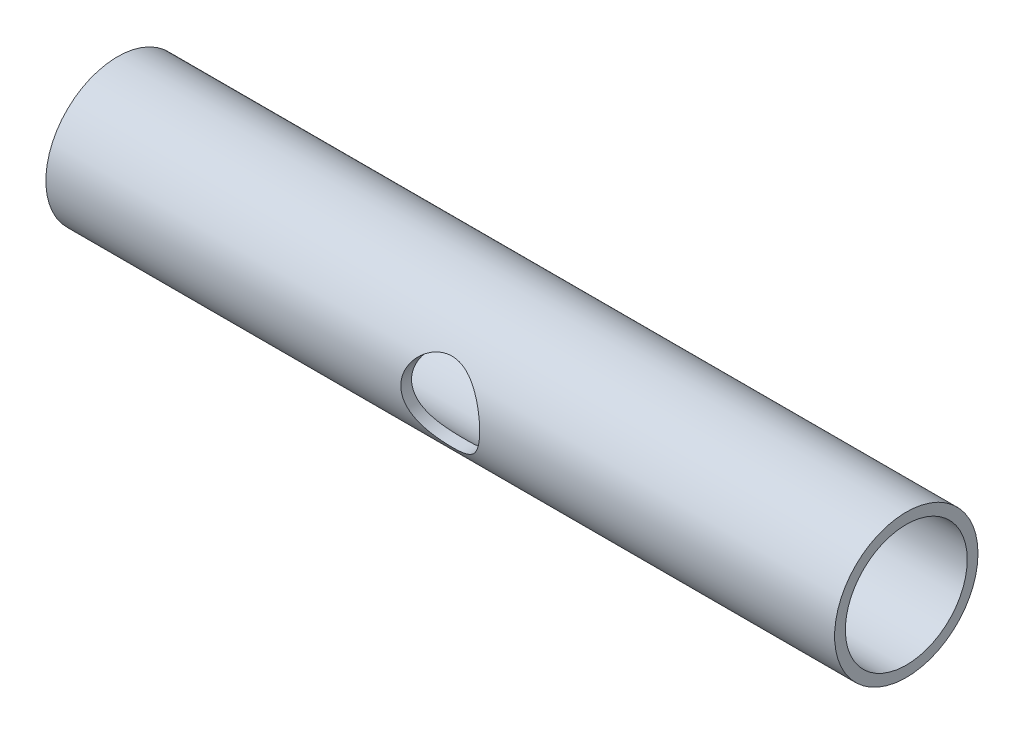
ISO-10303-21;
HEADER;
FILE_DESCRIPTION(('STEP AP214'),'2;1');
FILE_NAME('part.step','',(''),(''),'','','');
FILE_SCHEMA(('AUTOMOTIVE_DESIGN { 1 0 10303 214 1 1 1 1 }'));
ENDSEC;
DATA;
#1=APPLICATION_CONTEXT('core data for automotive mechanical design processes');
#2=APPLICATION_PROTOCOL_DEFINITION('international standard','automotive_design',2000,#1);
#3=PRODUCT_CONTEXT('',#1,'mechanical');
#4=PRODUCT('Part','Part','',(#3));
#5=PRODUCT_RELATED_PRODUCT_CATEGORY('part','',(#4));
#6=PRODUCT_DEFINITION_FORMATION('','',#4);
#7=PRODUCT_DEFINITION_CONTEXT('part definition',#1,'design');
#8=PRODUCT_DEFINITION('design','',#6,#7);
#9=PRODUCT_DEFINITION_SHAPE('','',#8);
#10=(LENGTH_UNIT() NAMED_UNIT(*) SI_UNIT(.MILLI.,.METRE.));
#11=(NAMED_UNIT(*) PLANE_ANGLE_UNIT() SI_UNIT($,.RADIAN.));
#12=(NAMED_UNIT(*) SI_UNIT($,.STERADIAN.) SOLID_ANGLE_UNIT());
#13=UNCERTAINTY_MEASURE_WITH_UNIT(LENGTH_MEASURE(1.E-05),#10,'distance_accuracy_value','');
#14=(GEOMETRIC_REPRESENTATION_CONTEXT(3) GLOBAL_UNCERTAINTY_ASSIGNED_CONTEXT((#13)) GLOBAL_UNIT_ASSIGNED_CONTEXT((#10,
#11,#12)) REPRESENTATION_CONTEXT('',''));
#15=CARTESIAN_POINT('',(0.,0.,0.));
#16=DIRECTION('',(0.,0.,1.));
#17=DIRECTION('',(1.,0.,0.));
#18=AXIS2_PLACEMENT_3D('',#15,#16,#17);
#19=CARTESIAN_POINT('',(110.,0.,0.));
#20=DIRECTION('',(1.,0.,0.));
#21=DIRECTION('',(0.,0.,-1.));
#22=AXIS2_PLACEMENT_3D('',#19,#20,#21);
#23=PLANE('',#22);
#24=CARTESIAN_POINT('',(110.,0.,0.));
#25=DIRECTION('',(1.,0.,0.));
#26=DIRECTION('',(0.,0.,-1.));
#27=AXIS2_PLACEMENT_3D('',#24,#25,#26);
#28=CIRCLE('',#27,10.);
#29=CARTESIAN_POINT('',(110.,0.,-10.));
#30=VERTEX_POINT('',#29);
#31=EDGE_CURVE('E10',#30,#30,#28,.T.);
#32=ORIENTED_EDGE('',*,*,#31,.T.);
#33=EDGE_LOOP('',(#32));
#34=FACE_BOUND('',#33,.T.);
#35=CARTESIAN_POINT('',(110.,0.,0.));
#36=DIRECTION('',(1.,0.,0.));
#37=DIRECTION('',(0.,0.,-1.));
#38=AXIS2_PLACEMENT_3D('',#35,#36,#37);
#39=CIRCLE('',#38,8.5);
#40=CARTESIAN_POINT('',(110.,0.,-8.5));
#41=VERTEX_POINT('',#40);
#42=EDGE_CURVE('E55',#41,#41,#39,.T.);
#43=ORIENTED_EDGE('',*,*,#42,.F.);
#44=EDGE_LOOP('',(#43));
#45=FACE_BOUND('',#44,.T.);
#46=ADVANCED_FACE('F36',(#34,#45),#23,.T.);
#47=CARTESIAN_POINT('',(0.,0.,0.));
#48=DIRECTION('',(1.,0.,0.));
#49=DIRECTION('',(0.,0.,-1.));
#50=AXIS2_PLACEMENT_3D('',#47,#48,#49);
#51=PLANE('',#50);
#52=CARTESIAN_POINT('',(0.,0.,0.));
#53=DIRECTION('',(1.,0.,0.));
#54=DIRECTION('',(0.,0.,-1.));
#55=AXIS2_PLACEMENT_3D('',#52,#53,#54);
#56=CIRCLE('',#55,10.);
#57=CARTESIAN_POINT('',(0.,0.,-10.));
#58=VERTEX_POINT('',#57);
#59=EDGE_CURVE('E50',#58,#58,#56,.T.);
#60=ORIENTED_EDGE('',*,*,#59,.F.);
#61=EDGE_LOOP('',(#60));
#62=FACE_BOUND('',#61,.T.);
#63=CARTESIAN_POINT('',(0.,0.,0.));
#64=DIRECTION('',(1.,0.,0.));
#65=DIRECTION('',(0.,0.,-1.));
#66=AXIS2_PLACEMENT_3D('',#63,#64,#65);
#67=CIRCLE('',#66,8.5);
#68=CARTESIAN_POINT('',(0.,0.,-8.5));
#69=VERTEX_POINT('',#68);
#70=EDGE_CURVE('E58',#69,#69,#67,.T.);
#71=ORIENTED_EDGE('',*,*,#70,.T.);
#72=EDGE_LOOP('',(#71));
#73=FACE_BOUND('',#72,.T.);
#74=ADVANCED_FACE('F94',(#62,#73),#51,.F.);
#75=CARTESIAN_POINT('',(110.,0.,0.));
#76=DIRECTION('',(-1.,0.,0.));
#77=DIRECTION('',(0.,0.,1.));
#78=AXIS2_PLACEMENT_3D('',#75,#76,#77);
#79=CYLINDRICAL_SURFACE('',#78,10.);
#80=CARTESIAN_POINT('',(60.5,0.,-10.));
#81=CARTESIAN_POINT('',(60.5000014998061,0.142841752058878,-10.0000013253171));
#82=CARTESIAN_POINT('',(60.4944302367165,0.285665986079781,-9.9969335195706));
#83=CARTESIAN_POINT('',(60.47222036742,0.570239689293178,-9.98474372414085));
#84=CARTESIAN_POINT('',(60.4555784971668,0.711988829035867,-9.97561994892361));
#85=CARTESIAN_POINT('',(60.4114178031942,0.993411840442092,-9.95153761632946));
#86=CARTESIAN_POINT('',(60.3838885957706,1.1330835984815,-9.9365734889463));
#87=CARTESIAN_POINT('',(60.3182807694013,1.40927178286025,-9.9011791338125));
#88=CARTESIAN_POINT('',(60.2801978420495,1.54578689583191,-9.88074667380979));
#89=CARTESIAN_POINT('',(60.194110823273,1.81410275102406,-9.83501204865348));
#90=CARTESIAN_POINT('',(60.1461530291059,1.9459222415247,-9.80973264463814));
#91=CARTESIAN_POINT('',(60.0406901633313,2.20476755536612,-9.75482138133249));
#92=CARTESIAN_POINT('',(59.9831814798897,2.33179154281557,-9.72518787595395));
#93=CARTESIAN_POINT('',(59.7971277357148,2.70454712408485,-9.63072907142522));
#94=CARTESIAN_POINT('',(59.6549701658791,2.94222352099016,-9.56029904906485));
#95=CARTESIAN_POINT('',(59.3275950484963,3.40709885210692,-9.40510071299984));
#96=CARTESIAN_POINT('',(59.1400880881361,3.63245231290911,-9.31967934451281));
#97=CARTESIAN_POINT('',(58.7323814875803,4.05027005649351,-9.14585008459779));
#98=CARTESIAN_POINT('',(58.5121516401802,4.24270359328259,-9.05743949262799));
#99=CARTESIAN_POINT('',(58.0191805591708,4.60842590708714,-8.87738336369875));
#100=CARTESIAN_POINT('',(57.7434034974015,4.77796075069635,-8.78627724878627));
#101=CARTESIAN_POINT('',(57.3077042581795,4.99508838788048,-8.6634891383539));
#102=CARTESIAN_POINT('',(57.1587463668645,5.06128412115967,-8.6248612077339));
#103=CARTESIAN_POINT('',(56.8542960812165,5.1805658273668,-8.55374495363447));
#104=CARTESIAN_POINT('',(56.6988079930846,5.23366028561747,-8.52125265949637));
#105=CARTESIAN_POINT('',(56.3923017539671,5.32309800232022,-8.46565009064032));
#106=CARTESIAN_POINT('',(56.2416119311837,5.36028102937659,-8.4420802476158));
#107=CARTESIAN_POINT('',(55.9367229976748,5.42187353079097,-8.40265611303222));
#108=CARTESIAN_POINT('',(55.7825260145234,5.4462905446175,-8.38679726783014));
#109=CARTESIAN_POINT('',(55.4721249024936,5.48192299182762,-8.36355045676607));
#110=CARTESIAN_POINT('',(55.3159228430548,5.49315107892035,-8.35615437174649));
#111=CARTESIAN_POINT('',(55.0029709521355,5.50222552899403,-8.35018254815688));
#112=CARTESIAN_POINT('',(54.8462211985219,5.50007372257812,-8.35160560297439));
#113=CARTESIAN_POINT('',(54.5576761929259,5.48378840679718,-8.362304177594));
#114=CARTESIAN_POINT('',(54.4257234765576,5.47153363404034,-8.37034812856275));
#115=CARTESIAN_POINT('',(54.1634984302373,5.43762330738641,-8.39241700242708));
#116=CARTESIAN_POINT('',(54.0332266239936,5.41596489317585,-8.40644374509048));
#117=CARTESIAN_POINT('',(53.7752605887803,5.3635189397094,-8.44000182353256));
#118=CARTESIAN_POINT('',(53.6475663539543,5.3327314211979,-8.45953314680297));
#119=CARTESIAN_POINT('',(53.395460771189,5.26237647986399,-8.50347627264488));
#120=CARTESIAN_POINT('',(53.2710507547622,5.22280555536868,-8.52789002130324));
#121=CARTESIAN_POINT('',(52.8985413420031,5.08962534035009,-8.60852268821013));
#122=CARTESIAN_POINT('',(52.6565141340696,4.9826468965488,-8.67139237679696));
#123=CARTESIAN_POINT('',(52.1927216533206,4.73690186702311,-8.80803472474407));
#124=CARTESIAN_POINT('',(51.9709651842401,4.59812156040827,-8.88181208532226));
#125=CARTESIAN_POINT('',(51.5170373913182,4.2672928416758,-9.04596391719774));
#126=CARTESIAN_POINT('',(51.2887437071326,4.07029459887438,-9.13712038619752));
#127=CARTESIAN_POINT('',(50.8665474963898,3.6407717221147,-9.31659078642609));
#128=CARTESIAN_POINT('',(50.6726684979157,3.40822298418385,-9.40490273945531));
#129=CARTESIAN_POINT('',(50.4055168658468,3.02769936677207,-9.53166449287198));
#130=CARTESIAN_POINT('',(50.3181320650183,2.89078692652741,-9.5741788439289));
#131=CARTESIAN_POINT('',(50.1553544020778,2.60880759779842,-9.65482165281565));
#132=CARTESIAN_POINT('',(50.0799564157997,2.46374422978986,-9.69295198280235));
#133=CARTESIAN_POINT('',(49.9419968907861,2.16643764569557,-9.76370281263216));
#134=CARTESIAN_POINT('',(49.8794289009963,2.01419808546738,-9.79632608001704));
#135=CARTESIAN_POINT('',(49.7678929707509,1.70360443439008,-9.85508466904527));
#136=CARTESIAN_POINT('',(49.7189230955935,1.54525121703052,-9.88122091358791));
#137=CARTESIAN_POINT('',(49.6392030314179,1.23876719934142,-9.92406797790065));
#138=CARTESIAN_POINT('',(49.6071809356451,1.09105745977756,-9.94142981891385));
#139=CARTESIAN_POINT('',(49.5553518915687,0.792902539913913,-9.96963983396893));
#140=CARTESIAN_POINT('',(49.5355435427708,0.642457675275713,-9.98048875481365));
#141=CARTESIAN_POINT('',(49.5084347383602,0.340185751134487,-9.99535695727727));
#142=CARTESIAN_POINT('',(49.5011279395879,0.188359431905523,-9.99937970241998));
#143=CARTESIAN_POINT('',(49.4991140358647,-0.115397784685616,-10.000487212106));
#144=CARTESIAN_POINT('',(49.5044061156619,-0.267328674645216,-9.99757242556526));
#145=CARTESIAN_POINT('',(49.5263711527341,-0.555090017146401,-9.98551656359033));
#146=CARTESIAN_POINT('',(49.541877265566,-0.691038404175576,-9.97701403759353));
#147=CARTESIAN_POINT('',(49.5828882670887,-0.961013435543872,-9.95463729187315));
#148=CARTESIAN_POINT('',(49.6083962595508,-1.09503946994524,-9.94076140471112));
#149=CARTESIAN_POINT('',(49.6691118937126,-1.36019343131532,-9.90796226724198));
#150=CARTESIAN_POINT('',(49.7043164337844,-1.49132227054391,-9.88904063097659));
#151=CARTESIAN_POINT('',(49.7840736587402,-1.74998258370257,-9.8465602681033));
#152=CARTESIAN_POINT('',(49.828629990525,-1.87751263214374,-9.82299973269512));
#153=CARTESIAN_POINT('',(49.9277461065306,-2.13100055929735,-9.77117873265241));
#154=CARTESIAN_POINT('',(49.9825046937648,-2.25686186442488,-9.74282613973581));
#155=CARTESIAN_POINT('',(50.1008689237485,-2.50344497450166,-9.68240175637615));
#156=CARTESIAN_POINT('',(50.1644775496132,-2.62416502847458,-9.65032871247552));
#157=CARTESIAN_POINT('',(50.3678399484269,-2.97774605394808,-9.5495015352806));
#158=CARTESIAN_POINT('',(50.520187210055,-3.20217216376082,-9.47610871849305));
#159=CARTESIAN_POINT('',(50.8735284204,-3.64857882136404,-9.31399109156981));
#160=CARTESIAN_POINT('',(51.078058948817,-3.86747318592924,-9.22446967649404));
#161=CARTESIAN_POINT('',(51.4092583485192,-4.16880320735541,-9.09028347654795));
#162=CARTESIAN_POINT('',(51.5238343779804,-4.26481547517285,-9.04553232220248));
#163=CARTESIAN_POINT('',(51.7607489297887,-4.44742755665807,-8.9571569588291));
#164=CARTESIAN_POINT('',(51.8830888150443,-4.5340257104432,-8.91353294956809));
#165=CARTESIAN_POINT('',(52.14484838865,-4.70364737374315,-8.82527898219404));
#166=CARTESIAN_POINT('',(52.2848557699367,-4.78586336984145,-8.78083658924529));
#167=CARTESIAN_POINT('',(52.5725434988527,-4.93800714199399,-8.6961866776151));
#168=CARTESIAN_POINT('',(52.720220132361,-5.00794079563639,-8.65597713705672));
#169=CARTESIAN_POINT('',(53.0223408461846,-5.13475179600473,-8.58135986731129));
#170=CARTESIAN_POINT('',(53.176778596571,-5.19164105655858,-8.54694685167459));
#171=CARTESIAN_POINT('',(53.4914577463728,-5.29164807133967,-8.4853944161148));
#172=CARTESIAN_POINT('',(53.6516980541265,-5.33476840114518,-8.45825363602035));
#173=CARTESIAN_POINT('',(53.9608516137906,-5.40303118984829,-8.41479223555946));
#174=CARTESIAN_POINT('',(54.1093581839704,-5.42951066498988,-8.39767807342413));
#175=CARTESIAN_POINT('',(54.4087319333586,-5.47021149205791,-8.37122340830919));
#176=CARTESIAN_POINT('',(54.5595989365635,-5.48443375353873,-8.36188232852482));
#177=CARTESIAN_POINT('',(54.8621679063439,-5.50035784337409,-8.35141637552306));
#178=CARTESIAN_POINT('',(55.0138691816903,-5.50206881956722,-8.35028549928033));
#179=CARTESIAN_POINT('',(55.3167212357622,-5.49296232983145,-8.35627878087188));
#180=CARTESIAN_POINT('',(55.4678720588464,-5.48214589689606,-8.36340225806316));
#181=CARTESIAN_POINT('',(55.7476659010511,-5.45050665725191,-8.38404884662754));
#182=CARTESIAN_POINT('',(55.8765643564284,-5.43125166885692,-8.39656541507773));
#183=CARTESIAN_POINT('',(56.1320635670786,-5.38380329531335,-8.42706636056067));
#184=CARTESIAN_POINT('',(56.2586635718028,-5.35560704402958,-8.44505249079367));
#185=CARTESIAN_POINT('',(56.6338533278533,-5.25805956141963,-8.50639672586411));
#186=CARTESIAN_POINT('',(56.8779871165514,-5.17573170161389,-8.55715312962816));
#187=CARTESIAN_POINT('',(57.3638368725746,-4.97351417539059,-8.67632720331984));
#188=CARTESIAN_POINT('',(57.6044888623029,-4.851632703989,-8.74563621099548));
#189=CARTESIAN_POINT('',(58.0635778576425,-4.57561608218593,-8.89315570661007));
#190=CARTESIAN_POINT('',(58.282002982486,-4.42146381549143,-8.9713709082756));
#191=CARTESIAN_POINT('',(58.7261628370999,-4.05717828293991,-9.14253204899318));
#192=CARTESIAN_POINT('',(58.9476694571544,-3.84205672204817,-9.23586410876301));
#193=CARTESIAN_POINT('',(59.352972769162,-3.37593042311172,-9.4162312520407));
#194=CARTESIAN_POINT('',(59.5367423858173,-3.12490013907636,-9.50326178558824));
#195=CARTESIAN_POINT('',(59.7826568787164,-2.72071902073227,-9.62385148160563));
#196=CARTESIAN_POINT('',(59.8607347303059,-2.57870041732791,-9.66296672375161));
#197=CARTESIAN_POINT('',(60.0044694482241,-2.28727806087811,-9.73606040387869));
#198=CARTESIAN_POINT('',(60.0701324070663,-2.13787797587978,-9.7700413598182));
#199=CARTESIAN_POINT('',(60.1881364749023,-1.83300600966548,-9.83179734063237));
#200=CARTESIAN_POINT('',(60.2405030150912,-1.67754638551484,-9.85958419992875));
#201=CARTESIAN_POINT('',(60.3313199842934,-1.36162430458019,-9.90815319038245));
#202=CARTESIAN_POINT('',(60.3697776971522,-1.2011645142698,-9.92893898749869));
#203=CARTESIAN_POINT('',(60.4337784951021,-0.868435169900308,-9.96369342403182));
#204=CARTESIAN_POINT('',(60.4585708826175,-0.695978548540531,-9.97726455865953));
#205=CARTESIAN_POINT('',(60.4916806001035,-0.349005884743478,-9.99541697228057));
#206=CARTESIAN_POINT('',(60.4999981678958,-0.174489872071037,-9.99999838104469));
#207=CARTESIAN_POINT('',(60.5,0.,-10.));
#208=B_SPLINE_CURVE_WITH_KNOTS('',3,(#80,#81,#82,#83,#84,#85,#86,#87,#88,#89,#90,#91,#92,#93,
#94,#95,#96,#97,#98,#99,#100,#101,#102,#103,#104,#105,#106,#107,#108,#109,#110,#111,#112,#113,
#114,#115,#116,#117,#118,#119,#120,#121,#122,#123,#124,#125,#126,#127,#128,#129,#130,#131,#132,
#133,#134,#135,#136,#137,#138,#139,#140,#141,#142,#143,#144,#145,#146,#147,#148,#149,#150,#151,
#152,#153,#154,#155,#156,#157,#158,#159,#160,#161,#162,#163,#164,#165,#166,#167,#168,#169,#170,
#171,#172,#173,#174,#175,#176,#177,#178,#179,#180,#181,#182,#183,#184,#185,#186,#187,#188,#189,
#190,#191,#192,#193,#194,#195,#196,#197,#198,#199,#200,#201,#202,#203,#204,#205,#206,#207),
.UNSPECIFIED.,.T.,.F.,(4,2,2,2,2,2,2,2,2,2,2,2,2,2,2,2,2,2,2,2,2,2,2,2,2,2,2,2,2,2,2,2,2,2,2,2,
2,2,2,2,2,2,2,2,2,2,2,2,2,2,2,2,2,2,2,2,2,2,2,2,2,2,2,4),(0.,0.428354500831619,0.85683535326925,
1.28572585498715,1.71479170373485,2.14188994581637,2.56915007181696,3.42284428470344,
4.3352646920303,5.24853266826638,6.25177572751265,6.75372702641161,7.25535236736979,
7.72561526965101,8.19560012515657,8.66513369892868,9.13460303372056,9.53242317074399,
9.93036439791495,10.3283047208361,10.7264039761387,11.5389600350192,12.3518673328937,
13.293040231005,14.2348541175191,14.7379644883097,15.2408592060021,15.743500439655,
16.2460701222302,16.7018447273943,17.157567061258,17.6130580975835,18.06851966066,
18.4793205623039,18.8902490442125,19.301046235061,19.7120039223647,20.1320176181854,
20.552173234127,21.3920151581045,22.3258728342408,22.7936061040557,23.2614217106041,
23.7657769639548,24.2698902017559,24.7735411676835,25.2770978667837,25.7318681051628,
26.1866045941192,26.6410085614969,27.0953750619945,27.4877060268677,27.8801628813624,
28.6646145595203,29.4971139726443,30.3300560637595,31.2936579568471,32.2579488115965,
32.7575199605934,33.2568453089076,33.7552083113799,34.2533099493803,34.7765785312483,
35.2998395594409),.UNSPECIFIED.);
#209=CARTESIAN_POINT('',(60.5,0.,-10.));
#210=VERTEX_POINT('',#209);
#211=EDGE_CURVE('E83',#210,#210,#208,.T.);
#212=ORIENTED_EDGE('',*,*,#211,.T.);
#213=EDGE_LOOP('',(#212));
#214=FACE_BOUND('',#213,.T.);
#215=CARTESIAN_POINT('',(60.5,0.,10.));
#216=CARTESIAN_POINT('',(60.5000014998061,-0.142841752058878,10.0000013253171));
#217=CARTESIAN_POINT('',(60.4944302367165,-0.285665986079781,9.9969335195706));
#218=CARTESIAN_POINT('',(60.47222036742,-0.570239689293178,9.98474372414085));
#219=CARTESIAN_POINT('',(60.4555784971668,-0.711988829035867,9.97561994892361));
#220=CARTESIAN_POINT('',(60.4114178031942,-0.993411840442092,9.95153761632946));
#221=CARTESIAN_POINT('',(60.3838885957706,-1.1330835984815,9.9365734889463));
#222=CARTESIAN_POINT('',(60.3182807694013,-1.40927178286025,9.9011791338125));
#223=CARTESIAN_POINT('',(60.2801978420495,-1.54578689583191,9.88074667380979));
#224=CARTESIAN_POINT('',(60.194110823273,-1.81410275102406,9.83501204865348));
#225=CARTESIAN_POINT('',(60.1461530291059,-1.9459222415247,9.80973264463814));
#226=CARTESIAN_POINT('',(60.0406901633313,-2.20476755536612,9.75482138133249));
#227=CARTESIAN_POINT('',(59.9831814798897,-2.33179154281557,9.72518787595395));
#228=CARTESIAN_POINT('',(59.7971277357148,-2.70454712408485,9.63072907142522));
#229=CARTESIAN_POINT('',(59.6549701658791,-2.94222352099016,9.56029904906485));
#230=CARTESIAN_POINT('',(59.3275950484963,-3.40709885210692,9.40510071299984));
#231=CARTESIAN_POINT('',(59.1400880881361,-3.63245231290911,9.31967934451281));
#232=CARTESIAN_POINT('',(58.7323814875803,-4.05027005649351,9.14585008459779));
#233=CARTESIAN_POINT('',(58.5121516401802,-4.24270359328259,9.05743949262799));
#234=CARTESIAN_POINT('',(58.0191805591708,-4.60842590708714,8.87738336369875));
#235=CARTESIAN_POINT('',(57.7434034974015,-4.77796075069635,8.78627724878627));
#236=CARTESIAN_POINT('',(57.3077042581795,-4.99508838788048,8.6634891383539));
#237=CARTESIAN_POINT('',(57.1587463668645,-5.06128412115967,8.6248612077339));
#238=CARTESIAN_POINT('',(56.8542960812165,-5.1805658273668,8.55374495363447));
#239=CARTESIAN_POINT('',(56.6988079930846,-5.23366028561747,8.52125265949637));
#240=CARTESIAN_POINT('',(56.3923017539671,-5.32309800232022,8.46565009064032));
#241=CARTESIAN_POINT('',(56.2416119311837,-5.36028102937659,8.4420802476158));
#242=CARTESIAN_POINT('',(55.9367229976748,-5.42187353079097,8.40265611303222));
#243=CARTESIAN_POINT('',(55.7825260145234,-5.4462905446175,8.38679726783014));
#244=CARTESIAN_POINT('',(55.4721249024936,-5.48192299182762,8.36355045676607));
#245=CARTESIAN_POINT('',(55.3159228430548,-5.49315107892035,8.35615437174649));
#246=CARTESIAN_POINT('',(55.0029709521355,-5.50222552899403,8.35018254815688));
#247=CARTESIAN_POINT('',(54.8462211985219,-5.50007372257812,8.35160560297439));
#248=CARTESIAN_POINT('',(54.5576761929259,-5.48378840679718,8.362304177594));
#249=CARTESIAN_POINT('',(54.4257234765576,-5.47153363404034,8.37034812856275));
#250=CARTESIAN_POINT('',(54.1634984302373,-5.43762330738641,8.39241700242708));
#251=CARTESIAN_POINT('',(54.0332266239936,-5.41596489317585,8.40644374509048));
#252=CARTESIAN_POINT('',(53.7752605887803,-5.3635189397094,8.44000182353256));
#253=CARTESIAN_POINT('',(53.6475663539543,-5.3327314211979,8.45953314680297));
#254=CARTESIAN_POINT('',(53.395460771189,-5.26237647986399,8.50347627264488));
#255=CARTESIAN_POINT('',(53.2710507547622,-5.22280555536868,8.52789002130324));
#256=CARTESIAN_POINT('',(52.8985413420031,-5.08962534035009,8.60852268821013));
#257=CARTESIAN_POINT('',(52.6565141340696,-4.9826468965488,8.67139237679696));
#258=CARTESIAN_POINT('',(52.1927216533206,-4.73690186702311,8.80803472474407));
#259=CARTESIAN_POINT('',(51.9709651842401,-4.59812156040827,8.88181208532226));
#260=CARTESIAN_POINT('',(51.5170373913182,-4.2672928416758,9.04596391719774));
#261=CARTESIAN_POINT('',(51.2887437071326,-4.07029459887438,9.13712038619752));
#262=CARTESIAN_POINT('',(50.8665474963898,-3.6407717221147,9.31659078642609));
#263=CARTESIAN_POINT('',(50.6726684979157,-3.40822298418385,9.40490273945531));
#264=CARTESIAN_POINT('',(50.4055168658468,-3.02769936677207,9.53166449287198));
#265=CARTESIAN_POINT('',(50.3181320650183,-2.89078692652741,9.5741788439289));
#266=CARTESIAN_POINT('',(50.1553544020778,-2.60880759779842,9.65482165281565));
#267=CARTESIAN_POINT('',(50.0799564157997,-2.46374422978986,9.69295198280235));
#268=CARTESIAN_POINT('',(49.9419968907861,-2.16643764569557,9.76370281263216));
#269=CARTESIAN_POINT('',(49.8794289009963,-2.01419808546738,9.79632608001704));
#270=CARTESIAN_POINT('',(49.7678929707509,-1.70360443439008,9.85508466904527));
#271=CARTESIAN_POINT('',(49.7189230955935,-1.54525121703052,9.88122091358791));
#272=CARTESIAN_POINT('',(49.6392030314179,-1.23876719934142,9.92406797790065));
#273=CARTESIAN_POINT('',(49.6071809356451,-1.09105745977756,9.94142981891385));
#274=CARTESIAN_POINT('',(49.5553518915687,-0.792902539913913,9.96963983396893));
#275=CARTESIAN_POINT('',(49.5355435427708,-0.642457675275713,9.98048875481365));
#276=CARTESIAN_POINT('',(49.5084347383602,-0.340185751134487,9.99535695727727));
#277=CARTESIAN_POINT('',(49.5011279395879,-0.188359431905523,9.99937970241998));
#278=CARTESIAN_POINT('',(49.4991140358647,0.115397784685616,10.000487212106));
#279=CARTESIAN_POINT('',(49.5044061156619,0.267328674645216,9.99757242556526));
#280=CARTESIAN_POINT('',(49.5263711527341,0.555090017146401,9.98551656359033));
#281=CARTESIAN_POINT('',(49.541877265566,0.691038404175576,9.97701403759353));
#282=CARTESIAN_POINT('',(49.5828882670887,0.961013435543872,9.95463729187315));
#283=CARTESIAN_POINT('',(49.6083962595508,1.09503946994524,9.94076140471112));
#284=CARTESIAN_POINT('',(49.6691118937126,1.36019343131532,9.90796226724198));
#285=CARTESIAN_POINT('',(49.7043164337844,1.49132227054391,9.88904063097659));
#286=CARTESIAN_POINT('',(49.7840736587402,1.74998258370257,9.8465602681033));
#287=CARTESIAN_POINT('',(49.828629990525,1.87751263214374,9.82299973269512));
#288=CARTESIAN_POINT('',(49.9277461065306,2.13100055929735,9.77117873265241));
#289=CARTESIAN_POINT('',(49.9825046937648,2.25686186442488,9.74282613973581));
#290=CARTESIAN_POINT('',(50.1008689237485,2.50344497450166,9.68240175637615));
#291=CARTESIAN_POINT('',(50.1644775496132,2.62416502847458,9.65032871247552));
#292=CARTESIAN_POINT('',(50.3678399484269,2.97774605394808,9.5495015352806));
#293=CARTESIAN_POINT('',(50.520187210055,3.20217216376082,9.47610871849305));
#294=CARTESIAN_POINT('',(50.8735284204,3.64857882136404,9.31399109156981));
#295=CARTESIAN_POINT('',(51.078058948817,3.86747318592924,9.22446967649404));
#296=CARTESIAN_POINT('',(51.4092583485192,4.16880320735541,9.09028347654795));
#297=CARTESIAN_POINT('',(51.5238343779804,4.26481547517285,9.04553232220248));
#298=CARTESIAN_POINT('',(51.7607489297887,4.44742755665807,8.9571569588291));
#299=CARTESIAN_POINT('',(51.8830888150443,4.5340257104432,8.91353294956809));
#300=CARTESIAN_POINT('',(52.14484838865,4.70364737374315,8.82527898219404));
#301=CARTESIAN_POINT('',(52.2848557699367,4.78586336984145,8.78083658924529));
#302=CARTESIAN_POINT('',(52.5725434988527,4.93800714199399,8.6961866776151));
#303=CARTESIAN_POINT('',(52.720220132361,5.00794079563639,8.65597713705672));
#304=CARTESIAN_POINT('',(53.0223408461846,5.13475179600473,8.58135986731129));
#305=CARTESIAN_POINT('',(53.176778596571,5.19164105655858,8.54694685167459));
#306=CARTESIAN_POINT('',(53.4914577463728,5.29164807133967,8.4853944161148));
#307=CARTESIAN_POINT('',(53.6516980541265,5.33476840114518,8.45825363602035));
#308=CARTESIAN_POINT('',(53.9608516137906,5.40303118984829,8.41479223555946));
#309=CARTESIAN_POINT('',(54.1093581839704,5.42951066498988,8.39767807342413));
#310=CARTESIAN_POINT('',(54.4087319333586,5.47021149205791,8.37122340830919));
#311=CARTESIAN_POINT('',(54.5595989365635,5.48443375353873,8.36188232852482));
#312=CARTESIAN_POINT('',(54.8621679063439,5.50035784337409,8.35141637552306));
#313=CARTESIAN_POINT('',(55.0138691816903,5.50206881956722,8.35028549928033));
#314=CARTESIAN_POINT('',(55.3167212357622,5.49296232983145,8.35627878087188));
#315=CARTESIAN_POINT('',(55.4678720588464,5.48214589689606,8.36340225806316));
#316=CARTESIAN_POINT('',(55.7476659010511,5.45050665725191,8.38404884662754));
#317=CARTESIAN_POINT('',(55.8765643564284,5.43125166885692,8.39656541507773));
#318=CARTESIAN_POINT('',(56.1320635670786,5.38380329531335,8.42706636056067));
#319=CARTESIAN_POINT('',(56.2586635718028,5.35560704402958,8.44505249079367));
#320=CARTESIAN_POINT('',(56.6338533278533,5.25805956141963,8.50639672586411));
#321=CARTESIAN_POINT('',(56.8779871165514,5.17573170161389,8.55715312962816));
#322=CARTESIAN_POINT('',(57.3638368725746,4.97351417539059,8.67632720331984));
#323=CARTESIAN_POINT('',(57.6044888623029,4.851632703989,8.74563621099548));
#324=CARTESIAN_POINT('',(58.0635778576425,4.57561608218593,8.89315570661007));
#325=CARTESIAN_POINT('',(58.282002982486,4.42146381549143,8.9713709082756));
#326=CARTESIAN_POINT('',(58.7261628370999,4.05717828293991,9.14253204899318));
#327=CARTESIAN_POINT('',(58.9476694571544,3.84205672204817,9.23586410876301));
#328=CARTESIAN_POINT('',(59.352972769162,3.37593042311172,9.4162312520407));
#329=CARTESIAN_POINT('',(59.5367423858173,3.12490013907636,9.50326178558824));
#330=CARTESIAN_POINT('',(59.7826568787164,2.72071902073227,9.62385148160563));
#331=CARTESIAN_POINT('',(59.8607347303059,2.57870041732791,9.66296672375161));
#332=CARTESIAN_POINT('',(60.0044694482241,2.28727806087811,9.73606040387869));
#333=CARTESIAN_POINT('',(60.0701324070663,2.13787797587978,9.7700413598182));
#334=CARTESIAN_POINT('',(60.1881364749023,1.83300600966548,9.83179734063237));
#335=CARTESIAN_POINT('',(60.2405030150912,1.67754638551484,9.85958419992875));
#336=CARTESIAN_POINT('',(60.3313199842934,1.36162430458019,9.90815319038245));
#337=CARTESIAN_POINT('',(60.3697776971522,1.2011645142698,9.92893898749869));
#338=CARTESIAN_POINT('',(60.4337784951021,0.868435169900308,9.96369342403182));
#339=CARTESIAN_POINT('',(60.4585708826175,0.695978548540531,9.97726455865953));
#340=CARTESIAN_POINT('',(60.4916806001035,0.349005884743478,9.99541697228057));
#341=CARTESIAN_POINT('',(60.4999981678958,0.174489872071037,9.99999838104469));
#342=CARTESIAN_POINT('',(60.5,0.,10.));
#343=B_SPLINE_CURVE_WITH_KNOTS('',3,(#215,#216,#217,#218,#219,#220,#221,#222,#223,#224,#225,
#226,#227,#228,#229,#230,#231,#232,#233,#234,#235,#236,#237,#238,#239,#240,#241,#242,#243,#244,
#245,#246,#247,#248,#249,#250,#251,#252,#253,#254,#255,#256,#257,#258,#259,#260,#261,#262,#263,
#264,#265,#266,#267,#268,#269,#270,#271,#272,#273,#274,#275,#276,#277,#278,#279,#280,#281,#282,
#283,#284,#285,#286,#287,#288,#289,#290,#291,#292,#293,#294,#295,#296,#297,#298,#299,#300,#301,
#302,#303,#304,#305,#306,#307,#308,#309,#310,#311,#312,#313,#314,#315,#316,#317,#318,#319,#320,
#321,#322,#323,#324,#325,#326,#327,#328,#329,#330,#331,#332,#333,#334,#335,#336,#337,#338,#339,
#340,#341,#342),.UNSPECIFIED.,.T.,.F.,(4,2,2,2,2,2,2,2,2,2,2,2,2,2,2,2,2,2,2,2,2,2,2,2,2,2,2,2,
2,2,2,2,2,2,2,2,2,2,2,2,2,2,2,2,2,2,2,2,2,2,2,2,2,2,2,2,2,2,2,2,2,2,2,4),(0.,0.428354500831619,
0.85683535326925,1.28572585498715,1.71479170373485,2.14188994581637,2.56915007181696,
3.42284428470344,4.3352646920303,5.24853266826638,6.25177572751265,6.75372702641161,
7.25535236736979,7.72561526965101,8.19560012515657,8.66513369892868,9.13460303372056,
9.53242317074399,9.93036439791495,10.3283047208361,10.7264039761387,11.5389600350192,
12.3518673328937,13.293040231005,14.2348541175191,14.7379644883097,15.2408592060021,
15.743500439655,16.2460701222302,16.7018447273943,17.157567061258,17.6130580975835,
18.06851966066,18.4793205623039,18.8902490442125,19.301046235061,19.7120039223647,
20.1320176181854,20.552173234127,21.3920151581045,22.3258728342408,22.7936061040557,
23.2614217106041,23.7657769639548,24.2698902017559,24.7735411676835,25.2770978667837,
25.7318681051628,26.1866045941192,26.6410085614969,27.0953750619945,27.4877060268677,
27.8801628813624,28.6646145595203,29.4971139726443,30.3300560637595,31.2936579568471,
32.2579488115965,32.7575199605934,33.2568453089076,33.7552083113799,34.2533099493803,
34.7765785312483,35.2998395594409),.UNSPECIFIED.);
#344=CARTESIAN_POINT('',(60.5,0.,10.));
#345=VERTEX_POINT('',#344);
#346=EDGE_CURVE('E78',#345,#345,#343,.T.);
#347=ORIENTED_EDGE('',*,*,#346,.T.);
#348=EDGE_LOOP('',(#347));
#349=FACE_BOUND('',#348,.T.);
#350=ORIENTED_EDGE('',*,*,#31,.F.);
#351=EDGE_LOOP('',(#350));
#352=FACE_BOUND('',#351,.T.);
#353=ORIENTED_EDGE('',*,*,#59,.T.);
#354=EDGE_LOOP('',(#353));
#355=FACE_BOUND('',#354,.T.);
#356=ADVANCED_FACE('F38',(#214,#349,#352,#355),#79,.T.);
#357=CARTESIAN_POINT('',(110.,0.,0.));
#358=DIRECTION('',(-1.,0.,0.));
#359=DIRECTION('',(0.,0.,1.));
#360=AXIS2_PLACEMENT_3D('',#357,#358,#359);
#361=CYLINDRICAL_SURFACE('',#360,8.5);
#362=CARTESIAN_POINT('',(60.5,0.,8.5));
#363=CARTESIAN_POINT('',(60.5000044085031,-0.138979077221163,8.50000414829044));
#364=CARTESIAN_POINT('',(60.4947283320367,-0.277918214033354,8.496586417817));
#365=CARTESIAN_POINT('',(60.4737137970469,-0.554714511310608,8.48301083114602));
#366=CARTESIAN_POINT('',(60.4579734104937,-0.692571467649002,8.47285173286445));
#367=CARTESIAN_POINT('',(60.4162451570975,-0.966154118889222,8.44603208016636));
#368=CARTESIAN_POINT('',(60.3902513894439,-1.10187853966678,8.42936778207115));
#369=CARTESIAN_POINT('',(60.328369762572,-1.37019763320334,8.38993182882002));
#370=CARTESIAN_POINT('',(60.2924778027776,-1.5027909840686,8.36715764259513));
#371=CARTESIAN_POINT('',(60.2114693791178,-1.76326078206309,8.31615457006813));
#372=CARTESIAN_POINT('',(60.1664020607833,-1.89115824389612,8.28795478712418));
#373=CARTESIAN_POINT('',(60.0674304838894,-2.14228587554359,8.22662448569947));
#374=CARTESIAN_POINT('',(60.0135227988415,-2.26551421273572,8.19349205580645));
#375=CARTESIAN_POINT('',(59.8393587844018,-2.62718511058355,8.08769626248564));
#376=CARTESIAN_POINT('',(59.7065846736811,-2.85785686317341,8.00858486204853));
#377=CARTESIAN_POINT('',(59.3996428213298,-3.31280929897712,7.83197309277476));
#378=CARTESIAN_POINT('',(59.2229621102837,-3.53498885311854,7.73349362395162));
#379=CARTESIAN_POINT('',(58.8389670277167,-3.94867994488858,7.53067033013075));
#380=CARTESIAN_POINT('',(58.631610215581,-4.14014821586105,7.42631850663767));
#381=CARTESIAN_POINT('',(58.2836831093459,-4.41515148669829,7.26429873522814));
#382=CARTESIAN_POINT('',(58.1522886661931,-4.50992086053146,7.20567951010806));
#383=CARTESIAN_POINT('',(57.8808363963726,-4.68798118256975,7.09112425892819));
#384=CARTESIAN_POINT('',(57.7407767762744,-4.77126974300011,7.03518879260769));
#385=CARTESIAN_POINT('',(57.308601563679,-5.00268259021216,6.87446702480222));
#386=CARTESIAN_POINT('',(57.0037909005059,-5.13290999119875,6.77642112295177));
#387=CARTESIAN_POINT('',(56.4547266151573,-5.30965599420297,6.63827042767317));
#388=CARTESIAN_POINT('',(56.2168652156166,-5.36934540277449,6.58964677224618));
#389=CARTESIAN_POINT('',(55.8531825591458,-5.43482119102927,6.53555397099139));
#390=CARTESIAN_POINT('',(55.7308471471788,-5.45263486234948,6.52066525151815));
#391=CARTESIAN_POINT('',(55.4845969120633,-5.48000872182352,6.49767966124646));
#392=CARTESIAN_POINT('',(55.3606820736043,-5.48956882990863,6.48958285633714));
#393=CARTESIAN_POINT('',(55.1118101148016,-5.50027881826359,6.48050768512599));
#394=CARTESIAN_POINT('',(54.9868508890884,-5.50140024062314,6.47955340573116));
#395=CARTESIAN_POINT('',(54.7373016870311,-5.49514049720668,6.48486296407405));
#396=CARTESIAN_POINT('',(54.6127117124346,-5.48775929125051,6.49112683592198));
#397=CARTESIAN_POINT('',(54.3647989512601,-5.46461559084393,6.5106224479726));
#398=CARTESIAN_POINT('',(54.2414768674996,-5.4488486790672,6.52385786052847));
#399=CARTESIAN_POINT('',(53.9970004608427,-5.40919156291581,6.55677523223738));
#400=CARTESIAN_POINT('',(53.8758470650704,-5.3852979677144,6.57645988218329));
#401=CARTESIAN_POINT('',(53.5248740320758,-5.30379786187668,6.64263188700721));
#402=CARTESIAN_POINT('',(53.2989221028094,-5.23551696283184,6.69700857176564));
#403=CARTESIAN_POINT('',(52.8614832510768,-5.07261153166766,6.82121937769125));
#404=CARTESIAN_POINT('',(52.6500011299371,-4.9779783077041,6.89105859733951));
#405=CARTESIAN_POINT('',(52.2031913334488,-4.74377068293366,7.05484545003151));
#406=CARTESIAN_POINT('',(51.9713280737926,-4.59902140867104,7.15083461904506));
#407=CARTESIAN_POINT('',(51.5324488933075,-4.27786354107619,7.34747264704885));
#408=CARTESIAN_POINT('',(51.3254633307363,-4.10141690918721,7.44812699562434));
#409=CARTESIAN_POINT('',(51.0171680747968,-3.79647977400324,7.60613197844375));
#410=CARTESIAN_POINT('',(50.9069476648256,-3.67741233916975,7.66454954371856));
#411=CARTESIAN_POINT('',(50.6969166857865,-3.42926805082378,7.77873682449755));
#412=CARTESIAN_POINT('',(50.5971026860181,-3.3001945206624,7.83450740931252));
#413=CARTESIAN_POINT('',(50.4086973844348,-3.03260641275395,7.94191906622283));
#414=CARTESIAN_POINT('',(50.3200996106649,-2.89409735109836,7.993562513345));
#415=CARTESIAN_POINT('',(50.1549694158715,-2.60823760422682,8.09134687557822));
#416=CARTESIAN_POINT('',(50.0784336433658,-2.46088939077543,8.13748931829762));
#417=CARTESIAN_POINT('',(49.9522792923829,-2.18824002154206,8.21446962446192));
#418=CARTESIAN_POINT('',(49.9003321605103,-2.06435597951553,8.24652835191988));
#419=CARTESIAN_POINT('',(49.8053323860337,-1.81206731710052,8.30561176436176));
#420=CARTESIAN_POINT('',(49.7622781163814,-1.6836635286907,8.33263737012226));
#421=CARTESIAN_POINT('',(49.6855628408152,-1.42309354923854,8.38107138854467));
#422=CARTESIAN_POINT('',(49.651898213431,-1.29092883047567,8.40248196666333));
#423=CARTESIAN_POINT('',(49.5943829409307,-1.02370526481011,8.43920645853699));
#424=CARTESIAN_POINT('',(49.5705277854501,-0.88864777811454,8.45452317412553));
#425=CARTESIAN_POINT('',(49.5328692105843,-0.616026022609648,8.47875639656131));
#426=CARTESIAN_POINT('',(49.5191051745375,-0.47845405735041,8.4876478250638));
#427=CARTESIAN_POINT('',(49.5019855808353,-0.20239232638314,8.49871282699356));
#428=CARTESIAN_POINT('',(49.4986300281895,-0.0639025602333989,8.5008863971875));
#429=CARTESIAN_POINT('',(49.5023788507374,0.212880137954557,8.49846081620827));
#430=CARTESIAN_POINT('',(49.509483601252,0.351173062751788,8.49386142201765));
#431=CARTESIAN_POINT('',(49.5340450006139,0.62644368310215,8.4780054610954));
#432=CARTESIAN_POINT('',(49.5515013398397,0.763421417868791,8.46674909347741));
#433=CARTESIAN_POINT('',(49.5952102601684,1.02716355722602,8.43868991693227));
#434=CARTESIAN_POINT('',(49.6208958867808,1.15406056090257,8.42224543283019));
#435=CARTESIAN_POINT('',(49.6809150814657,1.40499228269795,8.38404055082));
#436=CARTESIAN_POINT('',(49.7152515999854,1.52902600848892,8.36227833934023));
#437=CARTESIAN_POINT('',(49.8306713851907,1.89567131629675,8.28965179526357));
#438=CARTESIAN_POINT('',(49.9242007580038,2.1330391155974,8.23142395259186));
#439=CARTESIAN_POINT('',(50.1485899513587,2.60519412584409,8.09491817985717));
#440=CARTESIAN_POINT('',(50.2816283980478,2.8386020781027,8.01551039360728));
#441=CARTESIAN_POINT('',(50.5776644501494,3.28083195517774,7.84489714308978));
#442=CARTESIAN_POINT('',(50.7406840512701,3.48963564330416,7.75368303174704));
#443=CARTESIAN_POINT('',(51.1207844350625,3.91076707956537,7.55105904368549));
#444=CARTESIAN_POINT('',(51.3423265891534,4.11865115865766,7.43870674120164));
#445=CARTESIAN_POINT('',(51.6984448409567,4.40144676822736,7.27250365200238));
#446=CARTESIAN_POINT('',(51.8211936579756,4.49091540320187,7.21746008721353));
#447=CARTESIAN_POINT('',(52.0743370628697,4.6597924830291,7.10959631608813));
#448=CARTESIAN_POINT('',(52.2047314730367,4.73920116157198,7.05677605812379));
#449=CARTESIAN_POINT('',(52.5735212959558,4.94307406163527,6.91670094075068));
#450=CARTESIAN_POINT('',(52.8196481839684,5.05672817569992,6.83329183881186));
#451=CARTESIAN_POINT('',(53.2031553035702,5.20000003550168,6.72410789735521));
#452=CARTESIAN_POINT('',(53.3333674580091,5.24322034895422,6.69037001905732));
#453=CARTESIAN_POINT('',(53.5980505887252,5.32010322006138,6.6293970655108));
#454=CARTESIAN_POINT('',(53.7325193561794,5.35377064733239,6.60215867825471));
#455=CARTESIAN_POINT('',(54.0063664398329,5.4113287390648,6.55506882381383));
#456=CARTESIAN_POINT('',(54.1457819300557,5.43511074525173,6.53529966121894));
#457=CARTESIAN_POINT('',(54.4269980092365,5.47190731189574,6.50452231274969));
#458=CARTESIAN_POINT('',(54.5687985232946,5.484922209845,6.49351385227381));
#459=CARTESIAN_POINT('',(54.8532890940049,5.49988626784773,6.4808448102816));
#460=CARTESIAN_POINT('',(54.9959783418616,5.50184433552247,6.47917670398332));
#461=CARTESIAN_POINT('',(55.2808650809407,5.49467137264183,6.48526089730564));
#462=CARTESIAN_POINT('',(55.4230626182298,5.48554141075871,6.49301228906829));
#463=CARTESIAN_POINT('',(55.6834391776792,5.4586873440347,6.51559521681864));
#464=CARTESIAN_POINT('',(55.8018980856798,5.44252975110055,6.52913059180784));
#465=CARTESIAN_POINT('',(56.0367332386772,5.40271966324791,6.5621094236931));
#466=CARTESIAN_POINT('',(56.1531088471613,5.3790649176556,6.58155465467837));
#467=CARTESIAN_POINT('',(56.4982210765438,5.29728188885348,6.6478410579482));
#468=CARTESIAN_POINT('',(56.7229299923706,5.22833621142811,6.70263168883709));
#469=CARTESIAN_POINT('',(57.2328371264867,5.03608511527843,6.84885555754842));
#470=CARTESIAN_POINT('',(57.5123002803209,4.90224223844623,6.94641066922879));
#471=CARTESIAN_POINT('',(57.9089399058392,4.67029202247292,7.10261496895625));
#472=CARTESIAN_POINT('',(58.0375324914998,4.58766148078979,7.1563977531712));
#473=CARTESIAN_POINT('',(58.2869137853481,4.41241514632193,7.26575953025235));
#474=CARTESIAN_POINT('',(58.40770312967,4.3198001691332,7.32133837614479));
#475=CARTESIAN_POINT('',(58.7609299730093,4.02496155479338,7.49007896267924));
#476=CARTESIAN_POINT('',(58.9808416628539,3.80772857825815,7.60384541932265));
#477=CARTESIAN_POINT('',(59.3829273629049,3.33701548724003,7.82186792414845));
#478=CARTESIAN_POINT('',(59.5651360842302,3.08356907930436,7.92613267010612));
#479=CARTESIAN_POINT('',(59.8669189040356,2.57662974773763,8.10394540117566));
#480=CARTESIAN_POINT('',(59.9914124315925,2.3268810064277,8.1796860362948));
#481=CARTESIAN_POINT('',(60.1495189931107,1.93704840556991,8.27743107401791));
#482=CARTESIAN_POINT('',(60.1974410976294,1.80460175934053,8.30736333192251));
#483=CARTESIAN_POINT('',(60.2832466239509,1.53533609761744,8.36131433367084));
#484=CARTESIAN_POINT('',(60.3211322411836,1.39851804569612,8.38533437070072));
#485=CARTESIAN_POINT('',(60.4019265360587,1.05517339833948,8.43678885470849));
#486=CARTESIAN_POINT('',(60.4385982737897,0.846551050646793,8.46037865972073));
#487=CARTESIAN_POINT('',(60.4876320913265,0.425254754661181,8.49198135271586));
#488=CARTESIAN_POINT('',(60.4999932568089,0.212580654285098,8.49999365482694));
#489=CARTESIAN_POINT('',(60.5,0.,8.5));
#490=B_SPLINE_CURVE_WITH_KNOTS('',3,(#362,#363,#364,#365,#366,#367,#368,#369,#370,#371,#372,
#373,#374,#375,#376,#377,#378,#379,#380,#381,#382,#383,#384,#385,#386,#387,#388,#389,#390,#391,
#392,#393,#394,#395,#396,#397,#398,#399,#400,#401,#402,#403,#404,#405,#406,#407,#408,#409,#410,
#411,#412,#413,#414,#415,#416,#417,#418,#419,#420,#421,#422,#423,#424,#425,#426,#427,#428,#429,
#430,#431,#432,#433,#434,#435,#436,#437,#438,#439,#440,#441,#442,#443,#444,#445,#446,#447,#448,
#449,#450,#451,#452,#453,#454,#455,#456,#457,#458,#459,#460,#461,#462,#463,#464,#465,#466,#467,
#468,#469,#470,#471,#472,#473,#474,#475,#476,#477,#478,#479,#480,#481,#482,#483,#484,#485,#486,
#487,#488,#489),.UNSPECIFIED.,.T.,.F.,(4,2,2,2,2,2,2,2,2,2,2,2,2,2,2,2,2,2,2,2,2,2,2,2,2,2,2,2,
2,2,2,2,2,2,2,2,2,2,2,2,2,2,2,2,2,2,2,2,2,2,2,2,2,2,2,2,2,2,2,2,2,2,2,4),(0.,0.416727363725735,
0.833531529992898,1.25057591743026,1.66779333625248,2.08283220119522,2.4980323153116,
3.32766147446155,4.22580697775649,5.1252068983736,5.64149009748121,6.15788051146242,
7.18782687663906,7.93459472050701,8.3077380215045,8.68088494236538,9.05528967081363,
9.42969616856239,9.80430008751398,10.1790605006175,10.9028027800755,11.6267840563347,
12.4928352775158,13.359932835914,13.8767373611016,14.3933709680266,14.9097050964139,
15.4258955050985,15.8397979122587,16.2536245241475,16.6672913067604,17.0807676734259,
17.4958492766576,17.9109310796699,18.3260277763934,18.7411120579807,19.1321962975643,
19.5234141001497,20.3052079338147,21.1424976201234,21.9804040533373,22.9478211433965,
23.4320709846827,23.9163095749079,24.7632976504899,25.1867319951655,25.6099501033599,
26.0377043989823,26.4654452862499,26.8928415270034,27.3201965782689,27.6807483742134,
28.0414085118695,28.7627680544692,29.7319086780825,30.2176282505664,30.7033081762222,
31.6870273392222,32.6698367747261,33.5332812526066,33.964803443569,34.3962311631928,
35.0336281425662,35.6710490940548),.UNSPECIFIED.);
#491=CARTESIAN_POINT('',(60.5,0.,8.5));
#492=VERTEX_POINT('',#491);
#493=EDGE_CURVE('E41',#492,#492,#490,.T.);
#494=ORIENTED_EDGE('',*,*,#493,.F.);
#495=EDGE_LOOP('',(#494));
#496=FACE_BOUND('',#495,.T.);
#497=CARTESIAN_POINT('',(60.5,0.,-8.5));
#498=CARTESIAN_POINT('',(60.5000044085031,0.138979077221163,-8.50000414829044));
#499=CARTESIAN_POINT('',(60.4947283320367,0.277918214033354,-8.496586417817));
#500=CARTESIAN_POINT('',(60.4737137970469,0.554714511310608,-8.48301083114602));
#501=CARTESIAN_POINT('',(60.4579734104937,0.692571467649002,-8.47285173286445));
#502=CARTESIAN_POINT('',(60.4162451570975,0.966154118889222,-8.44603208016636));
#503=CARTESIAN_POINT('',(60.3902513894439,1.10187853966678,-8.42936778207115));
#504=CARTESIAN_POINT('',(60.328369762572,1.37019763320334,-8.38993182882002));
#505=CARTESIAN_POINT('',(60.2924778027776,1.5027909840686,-8.36715764259513));
#506=CARTESIAN_POINT('',(60.2114693791178,1.76326078206309,-8.31615457006813));
#507=CARTESIAN_POINT('',(60.1664020607833,1.89115824389612,-8.28795478712418));
#508=CARTESIAN_POINT('',(60.0674304838894,2.14228587554359,-8.22662448569947));
#509=CARTESIAN_POINT('',(60.0135227988415,2.26551421273572,-8.19349205580645));
#510=CARTESIAN_POINT('',(59.8393587844018,2.62718511058355,-8.08769626248564));
#511=CARTESIAN_POINT('',(59.7065846736811,2.85785686317341,-8.00858486204853));
#512=CARTESIAN_POINT('',(59.3996428213298,3.31280929897712,-7.83197309277476));
#513=CARTESIAN_POINT('',(59.2229621102837,3.53498885311854,-7.73349362395162));
#514=CARTESIAN_POINT('',(58.8389670277167,3.94867994488858,-7.53067033013075));
#515=CARTESIAN_POINT('',(58.631610215581,4.14014821586105,-7.42631850663767));
#516=CARTESIAN_POINT('',(58.2836831093459,4.41515148669829,-7.26429873522814));
#517=CARTESIAN_POINT('',(58.1522886661931,4.50992086053146,-7.20567951010806));
#518=CARTESIAN_POINT('',(57.8808363963726,4.68798118256975,-7.09112425892819));
#519=CARTESIAN_POINT('',(57.7407767762744,4.77126974300011,-7.03518879260769));
#520=CARTESIAN_POINT('',(57.308601563679,5.00268259021216,-6.87446702480222));
#521=CARTESIAN_POINT('',(57.0037909005059,5.13290999119875,-6.77642112295177));
#522=CARTESIAN_POINT('',(56.4547266151573,5.30965599420297,-6.63827042767317));
#523=CARTESIAN_POINT('',(56.2168652156166,5.36934540277449,-6.58964677224618));
#524=CARTESIAN_POINT('',(55.8531825591458,5.43482119102927,-6.53555397099139));
#525=CARTESIAN_POINT('',(55.7308471471788,5.45263486234948,-6.52066525151815));
#526=CARTESIAN_POINT('',(55.4845969120633,5.48000872182352,-6.49767966124646));
#527=CARTESIAN_POINT('',(55.3606820736043,5.48956882990863,-6.48958285633714));
#528=CARTESIAN_POINT('',(55.1118101148016,5.50027881826359,-6.48050768512599));
#529=CARTESIAN_POINT('',(54.9868508890884,5.50140024062314,-6.47955340573116));
#530=CARTESIAN_POINT('',(54.7373016870311,5.49514049720668,-6.48486296407405));
#531=CARTESIAN_POINT('',(54.6127117124346,5.48775929125051,-6.49112683592198));
#532=CARTESIAN_POINT('',(54.3647989512601,5.46461559084393,-6.5106224479726));
#533=CARTESIAN_POINT('',(54.2414768674996,5.4488486790672,-6.52385786052847));
#534=CARTESIAN_POINT('',(53.9970004608427,5.40919156291581,-6.55677523223738));
#535=CARTESIAN_POINT('',(53.8758470650704,5.3852979677144,-6.57645988218329));
#536=CARTESIAN_POINT('',(53.5248740320758,5.30379786187668,-6.64263188700721));
#537=CARTESIAN_POINT('',(53.2989221028094,5.23551696283184,-6.69700857176564));
#538=CARTESIAN_POINT('',(52.8614832510768,5.07261153166766,-6.82121937769125));
#539=CARTESIAN_POINT('',(52.6500011299371,4.9779783077041,-6.89105859733951));
#540=CARTESIAN_POINT('',(52.2031913334488,4.74377068293366,-7.05484545003151));
#541=CARTESIAN_POINT('',(51.9713280737926,4.59902140867104,-7.15083461904506));
#542=CARTESIAN_POINT('',(51.5324488933075,4.27786354107619,-7.34747264704885));
#543=CARTESIAN_POINT('',(51.3254633307363,4.10141690918721,-7.44812699562434));
#544=CARTESIAN_POINT('',(51.0171680747968,3.79647977400324,-7.60613197844375));
#545=CARTESIAN_POINT('',(50.9069476648256,3.67741233916975,-7.66454954371856));
#546=CARTESIAN_POINT('',(50.6969166857865,3.42926805082378,-7.77873682449755));
#547=CARTESIAN_POINT('',(50.5971026860181,3.3001945206624,-7.83450740931252));
#548=CARTESIAN_POINT('',(50.4086973844348,3.03260641275395,-7.94191906622283));
#549=CARTESIAN_POINT('',(50.3200996106649,2.89409735109836,-7.993562513345));
#550=CARTESIAN_POINT('',(50.1549694158715,2.60823760422682,-8.09134687557822));
#551=CARTESIAN_POINT('',(50.0784336433658,2.46088939077543,-8.13748931829762));
#552=CARTESIAN_POINT('',(49.9522792923829,2.18824002154206,-8.21446962446192));
#553=CARTESIAN_POINT('',(49.9003321605103,2.06435597951553,-8.24652835191988));
#554=CARTESIAN_POINT('',(49.8053323860337,1.81206731710052,-8.30561176436176));
#555=CARTESIAN_POINT('',(49.7622781163814,1.6836635286907,-8.33263737012226));
#556=CARTESIAN_POINT('',(49.6855628408152,1.42309354923854,-8.38107138854467));
#557=CARTESIAN_POINT('',(49.651898213431,1.29092883047567,-8.40248196666333));
#558=CARTESIAN_POINT('',(49.5943829409307,1.02370526481011,-8.43920645853699));
#559=CARTESIAN_POINT('',(49.5705277854501,0.88864777811454,-8.45452317412553));
#560=CARTESIAN_POINT('',(49.5328692105843,0.616026022609648,-8.47875639656131));
#561=CARTESIAN_POINT('',(49.5191051745375,0.47845405735041,-8.4876478250638));
#562=CARTESIAN_POINT('',(49.5019855808353,0.20239232638314,-8.49871282699356));
#563=CARTESIAN_POINT('',(49.4986300281895,0.0639025602333989,-8.5008863971875));
#564=CARTESIAN_POINT('',(49.5023788507374,-0.212880137954557,-8.49846081620827));
#565=CARTESIAN_POINT('',(49.509483601252,-0.351173062751788,-8.49386142201765));
#566=CARTESIAN_POINT('',(49.5340450006139,-0.62644368310215,-8.4780054610954));
#567=CARTESIAN_POINT('',(49.5515013398397,-0.763421417868791,-8.46674909347741));
#568=CARTESIAN_POINT('',(49.5952102601684,-1.02716355722602,-8.43868991693227));
#569=CARTESIAN_POINT('',(49.6208958867808,-1.15406056090257,-8.42224543283019));
#570=CARTESIAN_POINT('',(49.6809150814657,-1.40499228269795,-8.38404055082));
#571=CARTESIAN_POINT('',(49.7152515999854,-1.52902600848892,-8.36227833934023));
#572=CARTESIAN_POINT('',(49.8306713851907,-1.89567131629675,-8.28965179526357));
#573=CARTESIAN_POINT('',(49.9242007580038,-2.1330391155974,-8.23142395259186));
#574=CARTESIAN_POINT('',(50.1485899513587,-2.60519412584409,-8.09491817985717));
#575=CARTESIAN_POINT('',(50.2816283980478,-2.8386020781027,-8.01551039360728));
#576=CARTESIAN_POINT('',(50.5776644501494,-3.28083195517774,-7.84489714308978));
#577=CARTESIAN_POINT('',(50.7406840512701,-3.48963564330416,-7.75368303174704));
#578=CARTESIAN_POINT('',(51.1207844350625,-3.91076707956537,-7.55105904368549));
#579=CARTESIAN_POINT('',(51.3423265891534,-4.11865115865766,-7.43870674120164));
#580=CARTESIAN_POINT('',(51.6984448409567,-4.40144676822736,-7.27250365200238));
#581=CARTESIAN_POINT('',(51.8211936579756,-4.49091540320187,-7.21746008721353));
#582=CARTESIAN_POINT('',(52.0743370628697,-4.6597924830291,-7.10959631608813));
#583=CARTESIAN_POINT('',(52.2047314730367,-4.73920116157198,-7.05677605812379));
#584=CARTESIAN_POINT('',(52.5735212959558,-4.94307406163527,-6.91670094075068));
#585=CARTESIAN_POINT('',(52.8196481839684,-5.05672817569992,-6.83329183881186));
#586=CARTESIAN_POINT('',(53.2031553035702,-5.20000003550168,-6.72410789735521));
#587=CARTESIAN_POINT('',(53.3333674580091,-5.24322034895422,-6.69037001905732));
#588=CARTESIAN_POINT('',(53.5980505887252,-5.32010322006138,-6.6293970655108));
#589=CARTESIAN_POINT('',(53.7325193561794,-5.35377064733239,-6.60215867825471));
#590=CARTESIAN_POINT('',(54.0063664398329,-5.4113287390648,-6.55506882381383));
#591=CARTESIAN_POINT('',(54.1457819300557,-5.43511074525173,-6.53529966121894));
#592=CARTESIAN_POINT('',(54.4269980092365,-5.47190731189574,-6.50452231274969));
#593=CARTESIAN_POINT('',(54.5687985232946,-5.484922209845,-6.49351385227381));
#594=CARTESIAN_POINT('',(54.8532890940049,-5.49988626784773,-6.4808448102816));
#595=CARTESIAN_POINT('',(54.9959783418616,-5.50184433552247,-6.47917670398332));
#596=CARTESIAN_POINT('',(55.2808650809407,-5.49467137264183,-6.48526089730564));
#597=CARTESIAN_POINT('',(55.4230626182298,-5.48554141075871,-6.49301228906829));
#598=CARTESIAN_POINT('',(55.6834391776792,-5.4586873440347,-6.51559521681864));
#599=CARTESIAN_POINT('',(55.8018980856798,-5.44252975110055,-6.52913059180784));
#600=CARTESIAN_POINT('',(56.0367332386772,-5.40271966324791,-6.5621094236931));
#601=CARTESIAN_POINT('',(56.1531088471613,-5.3790649176556,-6.58155465467837));
#602=CARTESIAN_POINT('',(56.4982210765438,-5.29728188885348,-6.6478410579482));
#603=CARTESIAN_POINT('',(56.7229299923706,-5.22833621142811,-6.70263168883709));
#604=CARTESIAN_POINT('',(57.2328371264867,-5.03608511527843,-6.84885555754842));
#605=CARTESIAN_POINT('',(57.5123002803209,-4.90224223844623,-6.94641066922879));
#606=CARTESIAN_POINT('',(57.9089399058392,-4.67029202247292,-7.10261496895625));
#607=CARTESIAN_POINT('',(58.0375324914998,-4.58766148078979,-7.1563977531712));
#608=CARTESIAN_POINT('',(58.2869137853481,-4.41241514632193,-7.26575953025235));
#609=CARTESIAN_POINT('',(58.40770312967,-4.3198001691332,-7.32133837614479));
#610=CARTESIAN_POINT('',(58.7609299730093,-4.02496155479338,-7.49007896267924));
#611=CARTESIAN_POINT('',(58.9808416628539,-3.80772857825815,-7.60384541932265));
#612=CARTESIAN_POINT('',(59.3829273629049,-3.33701548724003,-7.82186792414845));
#613=CARTESIAN_POINT('',(59.5651360842302,-3.08356907930436,-7.92613267010612));
#614=CARTESIAN_POINT('',(59.8669189040356,-2.57662974773763,-8.10394540117566));
#615=CARTESIAN_POINT('',(59.9914124315925,-2.3268810064277,-8.1796860362948));
#616=CARTESIAN_POINT('',(60.1495189931107,-1.93704840556991,-8.27743107401791));
#617=CARTESIAN_POINT('',(60.1974410976294,-1.80460175934053,-8.30736333192251));
#618=CARTESIAN_POINT('',(60.2832466239509,-1.53533609761744,-8.36131433367084));
#619=CARTESIAN_POINT('',(60.3211322411836,-1.39851804569612,-8.38533437070072));
#620=CARTESIAN_POINT('',(60.4019265360587,-1.05517339833948,-8.43678885470849));
#621=CARTESIAN_POINT('',(60.4385982737897,-0.846551050646793,-8.46037865972073));
#622=CARTESIAN_POINT('',(60.4876320913265,-0.425254754661181,-8.49198135271586));
#623=CARTESIAN_POINT('',(60.4999932568089,-0.212580654285098,-8.49999365482694));
#624=CARTESIAN_POINT('',(60.5,0.,-8.5));
#625=B_SPLINE_CURVE_WITH_KNOTS('',3,(#497,#498,#499,#500,#501,#502,#503,#504,#505,#506,#507,
#508,#509,#510,#511,#512,#513,#514,#515,#516,#517,#518,#519,#520,#521,#522,#523,#524,#525,#526,
#527,#528,#529,#530,#531,#532,#533,#534,#535,#536,#537,#538,#539,#540,#541,#542,#543,#544,#545,
#546,#547,#548,#549,#550,#551,#552,#553,#554,#555,#556,#557,#558,#559,#560,#561,#562,#563,#564,
#565,#566,#567,#568,#569,#570,#571,#572,#573,#574,#575,#576,#577,#578,#579,#580,#581,#582,#583,
#584,#585,#586,#587,#588,#589,#590,#591,#592,#593,#594,#595,#596,#597,#598,#599,#600,#601,#602,
#603,#604,#605,#606,#607,#608,#609,#610,#611,#612,#613,#614,#615,#616,#617,#618,#619,#620,#621,
#622,#623,#624),.UNSPECIFIED.,.T.,.F.,(4,2,2,2,2,2,2,2,2,2,2,2,2,2,2,2,2,2,2,2,2,2,2,2,2,2,2,2,
2,2,2,2,2,2,2,2,2,2,2,2,2,2,2,2,2,2,2,2,2,2,2,2,2,2,2,2,2,2,2,2,2,2,2,4),(0.,0.416727363725735,
0.833531529992898,1.25057591743026,1.66779333625248,2.08283220119522,2.4980323153116,
3.32766147446155,4.22580697775649,5.1252068983736,5.64149009748121,6.15788051146242,
7.18782687663906,7.93459472050701,8.3077380215045,8.68088494236538,9.05528967081363,
9.42969616856239,9.80430008751398,10.1790605006175,10.9028027800755,11.6267840563347,
12.4928352775158,13.359932835914,13.8767373611016,14.3933709680266,14.9097050964139,
15.4258955050985,15.8397979122587,16.2536245241475,16.6672913067604,17.0807676734259,
17.4958492766576,17.9109310796699,18.3260277763934,18.7411120579807,19.1321962975643,
19.5234141001497,20.3052079338147,21.1424976201234,21.9804040533373,22.9478211433965,
23.4320709846827,23.9163095749079,24.7632976504899,25.1867319951655,25.6099501033599,
26.0377043989823,26.4654452862499,26.8928415270034,27.3201965782689,27.6807483742134,
28.0414085118695,28.7627680544692,29.7319086780825,30.2176282505664,30.7033081762222,
31.6870273392222,32.6698367747261,33.5332812526066,33.964803443569,34.3962311631928,
35.0336281425662,35.6710490940548),.UNSPECIFIED.);
#626=CARTESIAN_POINT('',(60.5,0.,-8.5));
#627=VERTEX_POINT('',#626);
#628=EDGE_CURVE('E60',#627,#627,#625,.T.);
#629=ORIENTED_EDGE('',*,*,#628,.F.);
#630=EDGE_LOOP('',(#629));
#631=FACE_BOUND('',#630,.T.);
#632=ORIENTED_EDGE('',*,*,#42,.T.);
#633=EDGE_LOOP('',(#632));
#634=FACE_BOUND('',#633,.T.);
#635=ORIENTED_EDGE('',*,*,#70,.F.);
#636=EDGE_LOOP('',(#635));
#637=FACE_BOUND('',#636,.T.);
#638=ADVANCED_FACE('F65',(#496,#631,#634,#637),#361,.F.);
#639=CARTESIAN_POINT('',(55.,0.,-10.));
#640=DIRECTION('',(0.,0.,1.));
#641=DIRECTION('',(1.,0.,0.));
#642=AXIS2_PLACEMENT_3D('',#639,#640,#641);
#643=CYLINDRICAL_SURFACE('',#642,5.5);
#644=ORIENTED_EDGE('',*,*,#628,.T.);
#645=EDGE_LOOP('',(#644));
#646=FACE_BOUND('',#645,.T.);
#647=ORIENTED_EDGE('',*,*,#211,.F.);
#648=EDGE_LOOP('',(#647));
#649=FACE_BOUND('',#648,.T.);
#650=ADVANCED_FACE('F68',(#646,#649),#643,.F.);
#651=ORIENTED_EDGE('',*,*,#493,.T.);
#652=EDGE_LOOP('',(#651));
#653=FACE_BOUND('',#652,.T.);
#654=ORIENTED_EDGE('',*,*,#346,.F.);
#655=EDGE_LOOP('',(#654));
#656=FACE_BOUND('',#655,.T.);
#657=ADVANCED_FACE('F71',(#653,#656),#643,.F.);
#658=CLOSED_SHELL('',(#46,#74,#356,#638,#650,#657));
#659=MANIFOLD_SOLID_BREP('B2',#658);
#660=ADVANCED_BREP_SHAPE_REPRESENTATION('',(#18,#659),#14);
#661=SHAPE_DEFINITION_REPRESENTATION(#9,#660);
ENDSEC;
END-ISO-10303-21;
